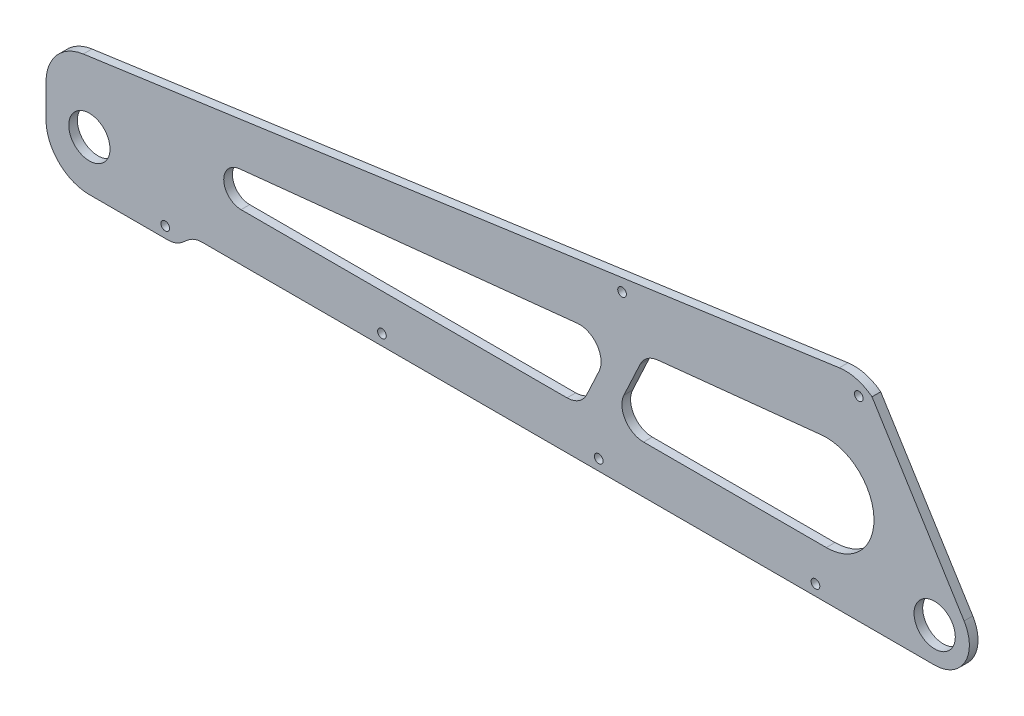
ISO-10303-21;
HEADER;
FILE_DESCRIPTION(('STEP AP214'),'2;1');
FILE_NAME('part.step','',(''),(''),'','','');
FILE_SCHEMA(('AUTOMOTIVE_DESIGN { 1 0 10303 214 1 1 1 1 }'));
ENDSEC;
DATA;
#1=APPLICATION_CONTEXT('core data for automotive mechanical design processes');
#2=APPLICATION_PROTOCOL_DEFINITION('international standard','automotive_design',2000,#1);
#3=PRODUCT_CONTEXT('',#1,'mechanical');
#4=PRODUCT('Part','Part','',(#3));
#5=PRODUCT_RELATED_PRODUCT_CATEGORY('part','',(#4));
#6=PRODUCT_DEFINITION_FORMATION('','',#4);
#7=PRODUCT_DEFINITION_CONTEXT('part definition',#1,'design');
#8=PRODUCT_DEFINITION('design','',#6,#7);
#9=PRODUCT_DEFINITION_SHAPE('','',#8);
#10=(LENGTH_UNIT() NAMED_UNIT(*) SI_UNIT(.MILLI.,.METRE.));
#11=(NAMED_UNIT(*) PLANE_ANGLE_UNIT() SI_UNIT($,.RADIAN.));
#12=(NAMED_UNIT(*) SI_UNIT($,.STERADIAN.) SOLID_ANGLE_UNIT());
#13=UNCERTAINTY_MEASURE_WITH_UNIT(LENGTH_MEASURE(1.E-05),#10,'distance_accuracy_value','');
#14=(GEOMETRIC_REPRESENTATION_CONTEXT(3) GLOBAL_UNCERTAINTY_ASSIGNED_CONTEXT((#13)) GLOBAL_UNIT_ASSIGNED_CONTEXT((#10,
#11,#12)) REPRESENTATION_CONTEXT('',''));
#15=CARTESIAN_POINT('',(0.,0.,0.));
#16=DIRECTION('',(0.,0.,1.));
#17=DIRECTION('',(1.,0.,0.));
#18=AXIS2_PLACEMENT_3D('',#15,#16,#17);
#19=CARTESIAN_POINT('',(175.291428570972,-28.5717369688571,4.));
#20=DIRECTION('',(0.,0.,1.));
#21=DIRECTION('',(1.,0.,0.));
#22=AXIS2_PLACEMENT_3D('',#19,#20,#21);
#23=PLANE('',#22);
#24=CARTESIAN_POINT('',(-179.708571428571,-46.5717369690893,4.));
#25=DIRECTION('',(0.,0.,1.));
#26=DIRECTION('',(1.,0.,0.));
#27=AXIS2_PLACEMENT_3D('',#24,#25,#26);
#28=CIRCLE('',#27,2.);
#29=CARTESIAN_POINT('',(-177.708571428571,-46.5717369690893,4.));
#30=VERTEX_POINT('',#29);
#31=EDGE_CURVE('E341',#30,#30,#28,.T.);
#32=ORIENTED_EDGE('',*,*,#31,.F.);
#33=EDGE_LOOP('',(#32));
#34=FACE_BOUND('',#33,.T.);
#35=CARTESIAN_POINT('',(-214.708571428571,-28.5717369690891,4.));
#36=DIRECTION('',(0.,0.,1.));
#37=DIRECTION('',(1.,0.,0.));
#38=AXIS2_PLACEMENT_3D('',#35,#36,#37);
#39=CIRCLE('',#38,9.52);
#40=CARTESIAN_POINT('',(-205.188571428571,-28.5717369690891,4.));
#41=VERTEX_POINT('',#40);
#42=EDGE_CURVE('E357',#41,#41,#39,.T.);
#43=ORIENTED_EDGE('',*,*,#42,.F.);
#44=EDGE_LOOP('',(#43));
#45=FACE_BOUND('',#44,.T.);
#46=CARTESIAN_POINT('',(175.291428570972,-28.5717369688571,4.));
#47=DIRECTION('',(0.,0.,1.));
#48=DIRECTION('',(1.,0.,0.));
#49=AXIS2_PLACEMENT_3D('',#46,#47,#48);
#50=CIRCLE('',#49,9.52000000010776);
#51=CARTESIAN_POINT('',(184.81142857108,-28.5717369688571,4.));
#52=VERTEX_POINT('',#51);
#53=EDGE_CURVE('E373',#52,#52,#50,.T.);
#54=ORIENTED_EDGE('',*,*,#53,.F.);
#55=EDGE_LOOP('',(#54));
#56=FACE_BOUND('',#55,.T.);
#57=CARTESIAN_POINT('',(120.291428571429,-39.5717369690891,4.));
#58=DIRECTION('',(0.,0.,1.));
#59=DIRECTION('',(1.,0.,0.));
#60=AXIS2_PLACEMENT_3D('',#57,#58,#59);
#61=CIRCLE('',#60,2.);
#62=CARTESIAN_POINT('',(122.291428571429,-39.5717369690891,4.));
#63=VERTEX_POINT('',#62);
#64=EDGE_CURVE('E389',#63,#63,#61,.T.);
#65=ORIENTED_EDGE('',*,*,#64,.F.);
#66=EDGE_LOOP('',(#65));
#67=FACE_BOUND('',#66,.T.);
#68=CARTESIAN_POINT('',(175.291428570972,-28.5717369688571,4.));
#69=DIRECTION('',(0.,0.,1.));
#70=DIRECTION('',(1.,0.,0.));
#71=AXIS2_PLACEMENT_3D('',#68,#69,#70);
#72=CIRCLE('',#71,16.0000000002321);
#73=CARTESIAN_POINT('',(175.291428570972,-44.5717369690892,4.));
#74=VERTEX_POINT('',#73);
#75=CARTESIAN_POINT('',(188.878227523528,-20.1219503307073,4.));
#76=VERTEX_POINT('',#75);
#77=EDGE_CURVE('E397',#74,#76,#72,.T.);
#78=ORIENTED_EDGE('',*,*,#77,.T.);
#79=DIRECTION('',(-0.528111664876703,0.84917493452242,0.));
#80=VECTOR('',#79,1.);
#81=CARTESIAN_POINT('',(146.384140968189,48.2062377555093,4.));
#82=LINE('',#81,#80);
#83=CARTESIAN_POINT('',(146.384140968189,48.2062377555093,4.));
#84=VERTEX_POINT('',#83);
#85=EDGE_CURVE('E401',#76,#84,#82,.T.);
#86=ORIENTED_EDGE('',*,*,#85,.T.);
#87=CARTESIAN_POINT('',(134.070911461676,32.446022683375,4.));
#88=DIRECTION('',(0.,0.,1.));
#89=DIRECTION('',(1.,0.,0.));
#90=AXIS2_PLACEMENT_3D('',#87,#88,#89);
#91=CIRCLE('',#90,19.9999999999998);
#92=CARTESIAN_POINT('',(131.287449442474,52.2513840582062,4.));
#93=VERTEX_POINT('',#92);
#94=EDGE_CURVE('E405',#84,#93,#91,.T.);
#95=ORIENTED_EDGE('',*,*,#94,.T.);
#96=DIRECTION('',(-0.99026806874157,-0.139173100960066,0.));
#97=VECTOR('',#96,1.);
#98=CARTESIAN_POINT('',(-217.492033447773,3.2336244057423,4.));
#99=LINE('',#98,#97);
#100=CARTESIAN_POINT('',(-217.492033447773,3.23362440574231,4.));
#101=VERTEX_POINT('',#100);
#102=EDGE_CURVE('E408',#93,#101,#99,.T.);
#103=ORIENTED_EDGE('',*,*,#102,.T.);
#104=CARTESIAN_POINT('',(-214.708571428571,-16.5717369690893,4.));
#105=DIRECTION('',(0.,0.,1.));
#106=DIRECTION('',(1.,0.,0.));
#107=AXIS2_PLACEMENT_3D('',#104,#105,#106);
#108=CIRCLE('',#107,20.0000000000002);
#109=CARTESIAN_POINT('',(-234.708571428571,-16.5717369690891,4.));
#110=VERTEX_POINT('',#109);
#111=EDGE_CURVE('E411',#101,#110,#108,.T.);
#112=ORIENTED_EDGE('',*,*,#111,.T.);
#113=DIRECTION('',(0.,-1.,0.));
#114=VECTOR('',#113,1.);
#115=CARTESIAN_POINT('',(-234.708571428571,-31.5717369690891,4.));
#116=LINE('',#115,#114);
#117=CARTESIAN_POINT('',(-234.708571428571,-31.5717369690891,4.));
#118=VERTEX_POINT('',#117);
#119=EDGE_CURVE('E414',#110,#118,#116,.T.);
#120=ORIENTED_EDGE('',*,*,#119,.T.);
#121=CARTESIAN_POINT('',(-214.708571428571,-31.5717369690889,4.));
#122=DIRECTION('',(0.,0.,1.));
#123=DIRECTION('',(1.,0.,0.));
#124=AXIS2_PLACEMENT_3D('',#121,#122,#123);
#125=CIRCLE('',#124,20.0000000000002);
#126=CARTESIAN_POINT('',(-214.708571428571,-51.5717369690891,4.));
#127=VERTEX_POINT('',#126);
#128=EDGE_CURVE('E417',#118,#127,#125,.T.);
#129=ORIENTED_EDGE('',*,*,#128,.T.);
#130=DIRECTION('',(1.,0.,0.));
#131=VECTOR('',#130,1.);
#132=CARTESIAN_POINT('',(-178.348273771233,-51.5717369690891,4.));
#133=LINE('',#132,#131);
#134=CARTESIAN_POINT('',(-178.348273771233,-51.5717369690891,4.));
#135=VERTEX_POINT('',#134);
#136=EDGE_CURVE('E420',#127,#135,#133,.T.);
#137=ORIENTED_EDGE('',*,*,#136,.T.);
#138=CARTESIAN_POINT('',(-178.348273771233,-41.5717369690893,4.));
#139=DIRECTION('',(0.,0.,1.));
#140=DIRECTION('',(1.,0.,0.));
#141=AXIS2_PLACEMENT_3D('',#138,#139,#140);
#142=CIRCLE('',#141,9.99999999999978);
#143=CARTESIAN_POINT('',(-171.920397674368,-49.2321814002789,4.));
#144=VERTEX_POINT('',#143);
#145=EDGE_CURVE('E423',#135,#144,#142,.T.);
#146=ORIENTED_EDGE('',*,*,#145,.T.);
#147=DIRECTION('',(0.766044443118976,0.642787609686542,0.));
#148=VECTOR('',#147,1.);
#149=CARTESIAN_POINT('',(-169.154470034615,-46.9112925378994,4.));
#150=LINE('',#149,#148);
#151=CARTESIAN_POINT('',(-169.154470034615,-46.9112925378993,4.));
#152=VERTEX_POINT('',#151);
#153=EDGE_CURVE('E426',#144,#152,#150,.T.);
#154=ORIENTED_EDGE('',*,*,#153,.T.);
#155=CARTESIAN_POINT('',(-162.72659393775,-54.5717369690888,4.));
#156=DIRECTION('',(0.,0.,-1.));
#157=DIRECTION('',(1.,0.,0.));
#158=AXIS2_PLACEMENT_3D('',#155,#156,#157);
#159=CIRCLE('',#158,9.99999999999969);
#160=CARTESIAN_POINT('',(-162.72659393775,-44.5717369690891,4.));
#161=VERTEX_POINT('',#160);
#162=EDGE_CURVE('E429',#152,#161,#159,.T.);
#163=ORIENTED_EDGE('',*,*,#162,.T.);
#164=DIRECTION('',(1.,0.,0.));
#165=VECTOR('',#164,1.);
#166=CARTESIAN_POINT('',(-162.72659393775,-44.5717369690891,4.));
#167=LINE('',#166,#165);
#168=EDGE_CURVE('E432',#161,#74,#167,.T.);
#169=ORIENTED_EDGE('',*,*,#168,.T.);
#170=EDGE_LOOP('',(#78,#86,#95,#103,#112,#120,#129,#137,#146,#154,#163,#169));
#171=FACE_BOUND('',#170,.T.);
#172=CARTESIAN_POINT('',(31.0623115741737,32.4282630309108,4.));
#173=DIRECTION('',(0.,0.,1.));
#174=DIRECTION('',(1.,0.,0.));
#175=AXIS2_PLACEMENT_3D('',#172,#173,#174);
#176=CIRCLE('',#175,2.);
#177=CARTESIAN_POINT('',(33.0623115741737,32.4282630309108,4.));
#178=VERTEX_POINT('',#177);
#179=EDGE_CURVE('E381',#178,#178,#176,.T.);
#180=ORIENTED_EDGE('',*,*,#179,.F.);
#181=EDGE_LOOP('',(#180));
#182=FACE_BOUND('',#181,.T.);
#183=CARTESIAN_POINT('',(-79.7085714285713,-39.5717369690891,4.));
#184=DIRECTION('',(0.,0.,1.));
#185=DIRECTION('',(1.,0.,0.));
#186=AXIS2_PLACEMENT_3D('',#183,#184,#185);
#187=CIRCLE('',#186,2.);
#188=CARTESIAN_POINT('',(-77.7085714285713,-39.5717369690891,4.));
#189=VERTEX_POINT('',#188);
#190=EDGE_CURVE('E365',#189,#189,#187,.T.);
#191=ORIENTED_EDGE('',*,*,#190,.F.);
#192=EDGE_LOOP('',(#191));
#193=FACE_BOUND('',#192,.T.);
#194=CARTESIAN_POINT('',(140.291428571429,45.4282630309109,4.));
#195=DIRECTION('',(0.,0.,1.));
#196=DIRECTION('',(1.,0.,0.));
#197=AXIS2_PLACEMENT_3D('',#194,#195,#196);
#198=CIRCLE('',#197,2.);
#199=CARTESIAN_POINT('',(142.291428571429,45.4282630309109,4.));
#200=VERTEX_POINT('',#199);
#201=EDGE_CURVE('E349',#200,#200,#198,.T.);
#202=ORIENTED_EDGE('',*,*,#201,.F.);
#203=EDGE_LOOP('',(#202));
#204=FACE_BOUND('',#203,.T.);
#205=CARTESIAN_POINT('',(20.2914285714287,-39.5717369690891,4.));
#206=DIRECTION('',(0.,0.,1.));
#207=DIRECTION('',(1.,0.,0.));
#208=AXIS2_PLACEMENT_3D('',#205,#206,#207);
#209=CIRCLE('',#208,2.);
#210=CARTESIAN_POINT('',(22.2914285714287,-39.5717369690891,4.));
#211=VERTEX_POINT('',#210);
#212=EDGE_CURVE('E333',#211,#211,#209,.T.);
#213=ORIENTED_EDGE('',*,*,#212,.F.);
#214=EDGE_LOOP('',(#213));
#215=FACE_BOUND('',#214,.T.);
#216=DIRECTION('',(1.,0.,0.));
#217=VECTOR('',#216,1.);
#218=CARTESIAN_POINT('',(40.9882843426035,-22.5717369690892,4.));
#219=LINE('',#218,#217);
#220=CARTESIAN_POINT('',(40.9882843426035,-22.5717369690892,4.));
#221=VERTEX_POINT('',#220);
#222=CARTESIAN_POINT('',(125.291428571429,-22.5717369690892,4.));
#223=VERTEX_POINT('',#222);
#224=EDGE_CURVE('E273',#221,#223,#219,.T.);
#225=ORIENTED_EDGE('',*,*,#224,.F.);
#226=CARTESIAN_POINT('',(40.9882843426036,-12.5717369690891,4.));
#227=DIRECTION('',(0.,0.,1.));
#228=DIRECTION('',(1.,0.,0.));
#229=AXIS2_PLACEMENT_3D('',#226,#227,#228);
#230=CIRCLE('',#229,10.);
#231=CARTESIAN_POINT('',(31.925206472237,-8.34555435168218,4.));
#232=VERTEX_POINT('',#231);
#233=EDGE_CURVE('E270',#232,#221,#230,.T.);
#234=ORIENTED_EDGE('',*,*,#233,.F.);
#235=DIRECTION('',(-0.422618261740698,-0.906307787036651,0.));
#236=VECTOR('',#235,1.);
#237=CARTESIAN_POINT('',(39.4225877131874,7.73263160523445,4.));
#238=LINE('',#237,#236);
#239=CARTESIAN_POINT('',(39.4225877131873,7.73263160523445,4.));
#240=VERTEX_POINT('',#239);
#241=EDGE_CURVE('E287',#240,#232,#238,.T.);
#242=ORIENTED_EDGE('',*,*,#241,.F.);
#243=CARTESIAN_POINT('',(48.4856655835538,3.50644898782758,4.));
#244=DIRECTION('',(0.,0.,1.));
#245=DIRECTION('',(1.,0.,0.));
#246=AXIS2_PLACEMENT_3D('',#243,#244,#245);
#247=CIRCLE('',#246,9.9999999999999);
#248=CARTESIAN_POINT('',(47.4514092630986,13.4528208823224,4.));
#249=VERTEX_POINT('',#248);
#250=EDGE_CURVE('E283',#249,#240,#247,.T.);
#251=ORIENTED_EDGE('',*,*,#250,.F.);
#252=DIRECTION('',(-0.994637189449491,-0.103425632045529,0.));
#253=VECTOR('',#252,1.);
#254=CARTESIAN_POINT('',(123.016064666427,21.3102811987996,4.));
#255=LINE('',#254,#253);
#256=CARTESIAN_POINT('',(123.016064666427,21.3102811987996,4.));
#257=VERTEX_POINT('',#256);
#258=EDGE_CURVE('E280',#257,#249,#255,.T.);
#259=ORIENTED_EDGE('',*,*,#258,.F.);
#260=CARTESIAN_POINT('',(125.291428571429,-0.571736969089159,4.));
#261=DIRECTION('',(0.,0.,1.));
#262=DIRECTION('',(1.,0.,0.));
#263=AXIS2_PLACEMENT_3D('',#260,#261,#262);
#264=CIRCLE('',#263,22.);
#265=EDGE_CURVE('E277',#223,#257,#264,.T.);
#266=ORIENTED_EDGE('',*,*,#265,.F.);
#267=EDGE_LOOP('',(#225,#234,#242,#251,#259,#266));
#268=FACE_BOUND('',#267,.T.);
#269=DIRECTION('',(1.,0.,0.));
#270=VECTOR('',#269,1.);
#271=CARTESIAN_POINT('',(-144.708571428571,-22.5717369690892,4.));
#272=LINE('',#271,#270);
#273=CARTESIAN_POINT('',(-144.708571428571,-22.5717369690892,4.));
#274=VERTEX_POINT('',#273);
#275=CARTESIAN_POINT('',(5.68019093580383,-22.5717369690892,4.));
#276=VERTEX_POINT('',#275);
#277=EDGE_CURVE('E210',#274,#276,#272,.T.);
#278=ORIENTED_EDGE('',*,*,#277,.F.);
#279=CARTESIAN_POINT('',(-144.708571428571,-14.5717369690891,4.));
#280=DIRECTION('',(0.,0.,1.));
#281=DIRECTION('',(1.,0.,0.));
#282=AXIS2_PLACEMENT_3D('',#279,#280,#281);
#283=CIRCLE('',#282,8.00000000000001);
#284=CARTESIAN_POINT('',(-145.535976484936,-6.61463945349322,4.));
#285=VERTEX_POINT('',#284);
#286=EDGE_CURVE('E201',#285,#274,#283,.T.);
#287=ORIENTED_EDGE('',*,*,#286,.F.);
#288=DIRECTION('',(-0.994637189449491,-0.103425632045529,0.));
#289=VECTOR('',#288,1.);
#290=CARTESIAN_POINT('',(10.3440467415016,9.59427581378043,4.));
#291=LINE('',#290,#289);
#292=CARTESIAN_POINT('',(10.3440467415016,9.59427581378042,4.));
#293=VERTEX_POINT('',#292);
#294=EDGE_CURVE('E236',#293,#285,#291,.T.);
#295=ORIENTED_EDGE('',*,*,#294,.F.);
#296=CARTESIAN_POINT('',(11.3783030619568,-0.352096080714473,4.));
#297=DIRECTION('',(0.,0.,1.));
#298=DIRECTION('',(1.,0.,0.));
#299=AXIS2_PLACEMENT_3D('',#296,#297,#298);
#300=CIRCLE('',#299,9.99999999999997);
#301=CARTESIAN_POINT('',(20.4413809323233,-4.57827869812142,4.));
#302=VERTEX_POINT('',#301);
#303=EDGE_CURVE('E233',#302,#293,#300,.T.);
#304=ORIENTED_EDGE('',*,*,#303,.F.);
#305=DIRECTION('',(0.422618261740691,0.906307787036654,0.));
#306=VECTOR('',#305,1.);
#307=CARTESIAN_POINT('',(14.7432688061705,-16.7979195864959,4.));
#308=LINE('',#307,#306);
#309=CARTESIAN_POINT('',(14.7432688061705,-16.7979195864959,4.));
#310=VERTEX_POINT('',#309);
#311=EDGE_CURVE('E228',#310,#302,#308,.T.);
#312=ORIENTED_EDGE('',*,*,#311,.F.);
#313=CARTESIAN_POINT('',(5.68019093580388,-12.5717369690892,4.));
#314=DIRECTION('',(0.,0.,1.));
#315=DIRECTION('',(1.,0.,0.));
#316=AXIS2_PLACEMENT_3D('',#313,#314,#315);
#317=CIRCLE('',#316,9.99999999999993);
#318=EDGE_CURVE('E224',#276,#310,#317,.T.);
#319=ORIENTED_EDGE('',*,*,#318,.F.);
#320=EDGE_LOOP('',(#278,#287,#295,#304,#312,#319));
#321=FACE_BOUND('',#320,.T.);
#322=ADVANCED_FACE('F39',(#34,#45,#56,#67,#171,#182,#193,#204,#215,#268,#321),#23,.T.);
#323=CARTESIAN_POINT('',(175.291428570972,-28.5717369688571,0.));
#324=DIRECTION('',(0.,0.,1.));
#325=DIRECTION('',(1.,0.,0.));
#326=AXIS2_PLACEMENT_3D('',#323,#324,#325);
#327=PLANE('',#326);
#328=CARTESIAN_POINT('',(40.9882843426036,-12.5717369690891,0.));
#329=DIRECTION('',(0.,0.,1.));
#330=DIRECTION('',(1.,0.,0.));
#331=AXIS2_PLACEMENT_3D('',#328,#329,#330);
#332=CIRCLE('',#331,10.);
#333=CARTESIAN_POINT('',(31.925206472237,-8.34555435168217,0.));
#334=VERTEX_POINT('',#333);
#335=CARTESIAN_POINT('',(40.9882843426035,-22.5717369690892,0.));
#336=VERTEX_POINT('',#335);
#337=EDGE_CURVE('E219',#334,#336,#332,.T.);
#338=ORIENTED_EDGE('',*,*,#337,.T.);
#339=DIRECTION('',(1.,0.,0.));
#340=VECTOR('',#339,1.);
#341=CARTESIAN_POINT('',(40.9882843426035,-22.5717369690892,0.));
#342=LINE('',#341,#340);
#343=CARTESIAN_POINT('',(125.291428571429,-22.5717369690892,0.));
#344=VERTEX_POINT('',#343);
#345=EDGE_CURVE('E294',#336,#344,#342,.T.);
#346=ORIENTED_EDGE('',*,*,#345,.T.);
#347=CARTESIAN_POINT('',(125.291428571429,-0.571736969089159,0.));
#348=DIRECTION('',(0.,0.,1.));
#349=DIRECTION('',(1.,0.,0.));
#350=AXIS2_PLACEMENT_3D('',#347,#348,#349);
#351=CIRCLE('',#350,22.);
#352=CARTESIAN_POINT('',(123.016064666427,21.3102811987996,0.));
#353=VERTEX_POINT('',#352);
#354=EDGE_CURVE('E298',#344,#353,#351,.T.);
#355=ORIENTED_EDGE('',*,*,#354,.T.);
#356=DIRECTION('',(-0.994637189449491,-0.103425632045529,0.));
#357=VECTOR('',#356,1.);
#358=CARTESIAN_POINT('',(123.016064666427,21.3102811987996,0.));
#359=LINE('',#358,#357);
#360=CARTESIAN_POINT('',(47.4514092630986,13.4528208823224,0.));
#361=VERTEX_POINT('',#360);
#362=EDGE_CURVE('E302',#353,#361,#359,.T.);
#363=ORIENTED_EDGE('',*,*,#362,.T.);
#364=CARTESIAN_POINT('',(48.4856655835538,3.50644898782758,0.));
#365=DIRECTION('',(0.,0.,1.));
#366=DIRECTION('',(1.,0.,0.));
#367=AXIS2_PLACEMENT_3D('',#364,#365,#366);
#368=CIRCLE('',#367,9.9999999999999);
#369=CARTESIAN_POINT('',(39.4225877131874,7.73263160523445,0.));
#370=VERTEX_POINT('',#369);
#371=EDGE_CURVE('E306',#361,#370,#368,.T.);
#372=ORIENTED_EDGE('',*,*,#371,.T.);
#373=DIRECTION('',(-0.422618261740698,-0.906307787036651,0.));
#374=VECTOR('',#373,1.);
#375=CARTESIAN_POINT('',(39.4225877131874,7.73263160523445,0.));
#376=LINE('',#375,#374);
#377=EDGE_CURVE('E274',#370,#334,#376,.T.);
#378=ORIENTED_EDGE('',*,*,#377,.T.);
#379=EDGE_LOOP('',(#338,#346,#355,#363,#372,#378));
#380=FACE_BOUND('',#379,.T.);
#381=CARTESIAN_POINT('',(175.291428570972,-28.5717369688571,0.));
#382=DIRECTION('',(0.,0.,1.));
#383=DIRECTION('',(1.,0.,0.));
#384=AXIS2_PLACEMENT_3D('',#381,#382,#383);
#385=CIRCLE('',#384,16.0000000002321);
#386=CARTESIAN_POINT('',(175.291428570972,-44.5717369690892,0.));
#387=VERTEX_POINT('',#386);
#388=CARTESIAN_POINT('',(188.878227523528,-20.1219503307073,0.));
#389=VERTEX_POINT('',#388);
#390=EDGE_CURVE('E393',#387,#389,#385,.T.);
#391=ORIENTED_EDGE('',*,*,#390,.F.);
#392=DIRECTION('',(1.,0.,0.));
#393=VECTOR('',#392,1.);
#394=CARTESIAN_POINT('',(-162.72659393775,-44.5717369690891,0.));
#395=LINE('',#394,#393);
#396=CARTESIAN_POINT('',(-162.72659393775,-44.5717369690891,0.));
#397=VERTEX_POINT('',#396);
#398=EDGE_CURVE('E402',#397,#387,#395,.T.);
#399=ORIENTED_EDGE('',*,*,#398,.F.);
#400=CARTESIAN_POINT('',(-162.72659393775,-54.5717369690888,0.));
#401=DIRECTION('',(0.,0.,-1.));
#402=DIRECTION('',(1.,0.,0.));
#403=AXIS2_PLACEMENT_3D('',#400,#401,#402);
#404=CIRCLE('',#403,9.99999999999969);
#405=CARTESIAN_POINT('',(-169.154470034615,-46.9112925378993,0.));
#406=VERTEX_POINT('',#405);
#407=EDGE_CURVE('E466',#406,#397,#404,.T.);
#408=ORIENTED_EDGE('',*,*,#407,.F.);
#409=DIRECTION('',(0.766044443118976,0.642787609686542,0.));
#410=VECTOR('',#409,1.);
#411=CARTESIAN_POINT('',(-169.154470034615,-46.9112925378994,0.));
#412=LINE('',#411,#410);
#413=CARTESIAN_POINT('',(-171.920397674368,-49.2321814002789,0.));
#414=VERTEX_POINT('',#413);
#415=EDGE_CURVE('E463',#414,#406,#412,.T.);
#416=ORIENTED_EDGE('',*,*,#415,.F.);
#417=CARTESIAN_POINT('',(-178.348273771233,-41.5717369690893,0.));
#418=DIRECTION('',(0.,0.,1.));
#419=DIRECTION('',(1.,0.,0.));
#420=AXIS2_PLACEMENT_3D('',#417,#418,#419);
#421=CIRCLE('',#420,9.99999999999978);
#422=CARTESIAN_POINT('',(-178.348273771233,-51.5717369690891,0.));
#423=VERTEX_POINT('',#422);
#424=EDGE_CURVE('E460',#423,#414,#421,.T.);
#425=ORIENTED_EDGE('',*,*,#424,.F.);
#426=DIRECTION('',(1.,0.,0.));
#427=VECTOR('',#426,1.);
#428=CARTESIAN_POINT('',(-178.348273771233,-51.5717369690891,0.));
#429=LINE('',#428,#427);
#430=CARTESIAN_POINT('',(-214.708571428571,-51.5717369690891,0.));
#431=VERTEX_POINT('',#430);
#432=EDGE_CURVE('E457',#431,#423,#429,.T.);
#433=ORIENTED_EDGE('',*,*,#432,.F.);
#434=CARTESIAN_POINT('',(-214.708571428571,-31.5717369690889,0.));
#435=DIRECTION('',(0.,0.,1.));
#436=DIRECTION('',(1.,0.,0.));
#437=AXIS2_PLACEMENT_3D('',#434,#435,#436);
#438=CIRCLE('',#437,20.0000000000002);
#439=CARTESIAN_POINT('',(-234.708571428571,-31.5717369690891,0.));
#440=VERTEX_POINT('',#439);
#441=EDGE_CURVE('E454',#440,#431,#438,.T.);
#442=ORIENTED_EDGE('',*,*,#441,.F.);
#443=DIRECTION('',(0.,-1.,0.));
#444=VECTOR('',#443,1.);
#445=CARTESIAN_POINT('',(-234.708571428571,-31.5717369690891,0.));
#446=LINE('',#445,#444);
#447=CARTESIAN_POINT('',(-234.708571428571,-16.5717369690891,0.));
#448=VERTEX_POINT('',#447);
#449=EDGE_CURVE('E451',#448,#440,#446,.T.);
#450=ORIENTED_EDGE('',*,*,#449,.F.);
#451=CARTESIAN_POINT('',(-214.708571428571,-16.5717369690893,0.));
#452=DIRECTION('',(0.,0.,1.));
#453=DIRECTION('',(1.,0.,0.));
#454=AXIS2_PLACEMENT_3D('',#451,#452,#453);
#455=CIRCLE('',#454,20.0000000000002);
#456=CARTESIAN_POINT('',(-217.492033447773,3.23362440574231,0.));
#457=VERTEX_POINT('',#456);
#458=EDGE_CURVE('E448',#457,#448,#455,.T.);
#459=ORIENTED_EDGE('',*,*,#458,.F.);
#460=DIRECTION('',(-0.99026806874157,-0.139173100960066,0.));
#461=VECTOR('',#460,1.);
#462=CARTESIAN_POINT('',(-217.492033447773,3.2336244057423,0.));
#463=LINE('',#462,#461);
#464=CARTESIAN_POINT('',(131.287449442474,52.2513840582062,0.));
#465=VERTEX_POINT('',#464);
#466=EDGE_CURVE('E445',#465,#457,#463,.T.);
#467=ORIENTED_EDGE('',*,*,#466,.F.);
#468=CARTESIAN_POINT('',(134.070911461676,32.446022683375,0.));
#469=DIRECTION('',(0.,0.,1.));
#470=DIRECTION('',(1.,0.,0.));
#471=AXIS2_PLACEMENT_3D('',#468,#469,#470);
#472=CIRCLE('',#471,19.9999999999998);
#473=CARTESIAN_POINT('',(146.384140968189,48.2062377555093,0.));
#474=VERTEX_POINT('',#473);
#475=EDGE_CURVE('E442',#474,#465,#472,.T.);
#476=ORIENTED_EDGE('',*,*,#475,.F.);
#477=DIRECTION('',(-0.528111664876703,0.84917493452242,0.));
#478=VECTOR('',#477,1.);
#479=CARTESIAN_POINT('',(146.384140968189,48.2062377555093,0.));
#480=LINE('',#479,#478);
#481=EDGE_CURVE('E439',#389,#474,#480,.T.);
#482=ORIENTED_EDGE('',*,*,#481,.F.);
#483=EDGE_LOOP('',(#391,#399,#408,#416,#425,#433,#442,#450,#459,#467,#476,#482));
#484=FACE_BOUND('',#483,.T.);
#485=CARTESIAN_POINT('',(120.291428571429,-39.5717369690891,0.));
#486=DIRECTION('',(0.,0.,1.));
#487=DIRECTION('',(1.,0.,0.));
#488=AXIS2_PLACEMENT_3D('',#485,#486,#487);
#489=CIRCLE('',#488,2.);
#490=CARTESIAN_POINT('',(122.291428571429,-39.5717369690891,0.));
#491=VERTEX_POINT('',#490);
#492=EDGE_CURVE('E385',#491,#491,#489,.T.);
#493=ORIENTED_EDGE('',*,*,#492,.T.);
#494=EDGE_LOOP('',(#493));
#495=FACE_BOUND('',#494,.T.);
#496=CARTESIAN_POINT('',(31.0623115741737,32.4282630309108,0.));
#497=DIRECTION('',(0.,0.,1.));
#498=DIRECTION('',(1.,0.,0.));
#499=AXIS2_PLACEMENT_3D('',#496,#497,#498);
#500=CIRCLE('',#499,2.);
#501=CARTESIAN_POINT('',(33.0623115741737,32.4282630309108,0.));
#502=VERTEX_POINT('',#501);
#503=EDGE_CURVE('E377',#502,#502,#500,.T.);
#504=ORIENTED_EDGE('',*,*,#503,.T.);
#505=EDGE_LOOP('',(#504));
#506=FACE_BOUND('',#505,.T.);
#507=CARTESIAN_POINT('',(175.291428570972,-28.5717369688571,0.));
#508=DIRECTION('',(0.,0.,1.));
#509=DIRECTION('',(1.,0.,0.));
#510=AXIS2_PLACEMENT_3D('',#507,#508,#509);
#511=CIRCLE('',#510,9.52000000010776);
#512=CARTESIAN_POINT('',(184.81142857108,-28.5717369688571,0.));
#513=VERTEX_POINT('',#512);
#514=EDGE_CURVE('E369',#513,#513,#511,.T.);
#515=ORIENTED_EDGE('',*,*,#514,.T.);
#516=EDGE_LOOP('',(#515));
#517=FACE_BOUND('',#516,.T.);
#518=CARTESIAN_POINT('',(-79.7085714285713,-39.5717369690891,0.));
#519=DIRECTION('',(0.,0.,1.));
#520=DIRECTION('',(1.,0.,0.));
#521=AXIS2_PLACEMENT_3D('',#518,#519,#520);
#522=CIRCLE('',#521,2.);
#523=CARTESIAN_POINT('',(-77.7085714285713,-39.5717369690891,0.));
#524=VERTEX_POINT('',#523);
#525=EDGE_CURVE('E361',#524,#524,#522,.T.);
#526=ORIENTED_EDGE('',*,*,#525,.T.);
#527=EDGE_LOOP('',(#526));
#528=FACE_BOUND('',#527,.T.);
#529=CARTESIAN_POINT('',(-214.708571428571,-28.5717369690891,0.));
#530=DIRECTION('',(0.,0.,1.));
#531=DIRECTION('',(1.,0.,0.));
#532=AXIS2_PLACEMENT_3D('',#529,#530,#531);
#533=CIRCLE('',#532,9.52);
#534=CARTESIAN_POINT('',(-205.188571428571,-28.5717369690891,0.));
#535=VERTEX_POINT('',#534);
#536=EDGE_CURVE('E353',#535,#535,#533,.T.);
#537=ORIENTED_EDGE('',*,*,#536,.T.);
#538=EDGE_LOOP('',(#537));
#539=FACE_BOUND('',#538,.T.);
#540=CARTESIAN_POINT('',(140.291428571429,45.4282630309109,0.));
#541=DIRECTION('',(0.,0.,1.));
#542=DIRECTION('',(1.,0.,0.));
#543=AXIS2_PLACEMENT_3D('',#540,#541,#542);
#544=CIRCLE('',#543,2.);
#545=CARTESIAN_POINT('',(142.291428571429,45.4282630309109,0.));
#546=VERTEX_POINT('',#545);
#547=EDGE_CURVE('E345',#546,#546,#544,.T.);
#548=ORIENTED_EDGE('',*,*,#547,.T.);
#549=EDGE_LOOP('',(#548));
#550=FACE_BOUND('',#549,.T.);
#551=CARTESIAN_POINT('',(-179.708571428571,-46.5717369690893,0.));
#552=DIRECTION('',(0.,0.,1.));
#553=DIRECTION('',(1.,0.,0.));
#554=AXIS2_PLACEMENT_3D('',#551,#552,#553);
#555=CIRCLE('',#554,2.);
#556=CARTESIAN_POINT('',(-177.708571428571,-46.5717369690893,0.));
#557=VERTEX_POINT('',#556);
#558=EDGE_CURVE('E337',#557,#557,#555,.T.);
#559=ORIENTED_EDGE('',*,*,#558,.T.);
#560=EDGE_LOOP('',(#559));
#561=FACE_BOUND('',#560,.T.);
#562=CARTESIAN_POINT('',(20.2914285714287,-39.5717369690891,0.));
#563=DIRECTION('',(0.,0.,1.));
#564=DIRECTION('',(1.,0.,0.));
#565=AXIS2_PLACEMENT_3D('',#562,#563,#564);
#566=CIRCLE('',#565,2.);
#567=CARTESIAN_POINT('',(22.2914285714287,-39.5717369690891,0.));
#568=VERTEX_POINT('',#567);
#569=EDGE_CURVE('E332',#568,#568,#566,.T.);
#570=ORIENTED_EDGE('',*,*,#569,.T.);
#571=EDGE_LOOP('',(#570));
#572=FACE_BOUND('',#571,.T.);
#573=CARTESIAN_POINT('',(-144.708571428571,-14.5717369690891,0.));
#574=DIRECTION('',(0.,0.,1.));
#575=DIRECTION('',(1.,0.,0.));
#576=AXIS2_PLACEMENT_3D('',#573,#574,#575);
#577=CIRCLE('',#576,8.00000000000001);
#578=CARTESIAN_POINT('',(-145.535976484936,-6.61463945349323,0.));
#579=VERTEX_POINT('',#578);
#580=CARTESIAN_POINT('',(-144.708571428571,-22.5717369690892,0.));
#581=VERTEX_POINT('',#580);
#582=EDGE_CURVE('E63',#579,#581,#577,.T.);
#583=ORIENTED_EDGE('',*,*,#582,.T.);
#584=DIRECTION('',(1.,0.,0.));
#585=VECTOR('',#584,1.);
#586=CARTESIAN_POINT('',(-144.708571428571,-22.5717369690892,0.));
#587=LINE('',#586,#585);
#588=CARTESIAN_POINT('',(5.68019093580383,-22.5717369690892,0.));
#589=VERTEX_POINT('',#588);
#590=EDGE_CURVE('E217',#581,#589,#587,.T.);
#591=ORIENTED_EDGE('',*,*,#590,.T.);
#592=CARTESIAN_POINT('',(5.68019093580388,-12.5717369690892,0.));
#593=DIRECTION('',(0.,0.,1.));
#594=DIRECTION('',(1.,0.,0.));
#595=AXIS2_PLACEMENT_3D('',#592,#593,#594);
#596=CIRCLE('',#595,9.99999999999993);
#597=CARTESIAN_POINT('',(14.7432688061705,-16.7979195864959,0.));
#598=VERTEX_POINT('',#597);
#599=EDGE_CURVE('E243',#589,#598,#596,.T.);
#600=ORIENTED_EDGE('',*,*,#599,.T.);
#601=DIRECTION('',(0.422618261740691,0.906307787036654,0.));
#602=VECTOR('',#601,1.);
#603=CARTESIAN_POINT('',(14.7432688061705,-16.7979195864959,0.));
#604=LINE('',#603,#602);
#605=CARTESIAN_POINT('',(20.4413809323233,-4.57827869812142,0.));
#606=VERTEX_POINT('',#605);
#607=EDGE_CURVE('E247',#598,#606,#604,.T.);
#608=ORIENTED_EDGE('',*,*,#607,.T.);
#609=CARTESIAN_POINT('',(11.3783030619568,-0.352096080714473,0.));
#610=DIRECTION('',(0.,0.,1.));
#611=DIRECTION('',(1.,0.,0.));
#612=AXIS2_PLACEMENT_3D('',#609,#610,#611);
#613=CIRCLE('',#612,9.99999999999997);
#614=CARTESIAN_POINT('',(10.3440467415016,9.59427581378041,0.));
#615=VERTEX_POINT('',#614);
#616=EDGE_CURVE('E251',#606,#615,#613,.T.);
#617=ORIENTED_EDGE('',*,*,#616,.T.);
#618=DIRECTION('',(-0.994637189449491,-0.103425632045529,0.));
#619=VECTOR('',#618,1.);
#620=CARTESIAN_POINT('',(10.3440467415016,9.59427581378043,0.));
#621=LINE('',#620,#619);
#622=EDGE_CURVE('E211',#615,#579,#621,.T.);
#623=ORIENTED_EDGE('',*,*,#622,.T.);
#624=EDGE_LOOP('',(#583,#591,#600,#608,#617,#623));
#625=FACE_BOUND('',#624,.T.);
#626=ADVANCED_FACE('F521',(#380,#484,#495,#506,#517,#528,#539,#550,#561,#572,#625),#327,.F.);
#627=CARTESIAN_POINT('',(175.291428570972,-28.5717369688571,4.));
#628=DIRECTION('',(0.,0.,-1.));
#629=DIRECTION('',(-1.,0.,0.));
#630=AXIS2_PLACEMENT_3D('',#627,#628,#629);
#631=CYLINDRICAL_SURFACE('',#630,16.0000000002321);
#632=ORIENTED_EDGE('',*,*,#390,.T.);
#633=DIRECTION('',(0.,0.,-1.));
#634=VECTOR('',#633,1.);
#635=CARTESIAN_POINT('',(188.878227523528,-20.1219503307073,4.));
#636=LINE('',#635,#634);
#637=EDGE_CURVE('E11',#76,#389,#636,.T.);
#638=ORIENTED_EDGE('',*,*,#637,.F.);
#639=ORIENTED_EDGE('',*,*,#77,.F.);
#640=DIRECTION('',(0.,0.,-1.));
#641=VECTOR('',#640,1.);
#642=CARTESIAN_POINT('',(175.291428570972,-44.5717369690892,4.));
#643=LINE('',#642,#641);
#644=EDGE_CURVE('E435',#74,#387,#643,.T.);
#645=ORIENTED_EDGE('',*,*,#644,.T.);
#646=EDGE_LOOP('',(#632,#638,#639,#645));
#647=FACE_BOUND('',#646,.T.);
#648=ADVANCED_FACE('F41',(#647),#631,.T.);
#649=CARTESIAN_POINT('',(146.384140968189,48.2062377555093,4.));
#650=DIRECTION('',(-0.84917493452242,-0.528111664876703,0.));
#651=DIRECTION('',(0.528111664876703,-0.84917493452242,0.));
#652=AXIS2_PLACEMENT_3D('',#649,#650,#651);
#653=PLANE('',#652);
#654=ORIENTED_EDGE('',*,*,#481,.T.);
#655=DIRECTION('',(0.,0.,-1.));
#656=VECTOR('',#655,1.);
#657=CARTESIAN_POINT('',(146.384140968189,48.2062377555093,4.));
#658=LINE('',#657,#656);
#659=EDGE_CURVE('E48',#84,#474,#658,.T.);
#660=ORIENTED_EDGE('',*,*,#659,.F.);
#661=ORIENTED_EDGE('',*,*,#85,.F.);
#662=ORIENTED_EDGE('',*,*,#637,.T.);
#663=EDGE_LOOP('',(#654,#660,#661,#662));
#664=FACE_BOUND('',#663,.T.);
#665=ADVANCED_FACE('F539',(#664),#653,.F.);
#666=CARTESIAN_POINT('',(134.070911461676,32.446022683375,4.));
#667=DIRECTION('',(0.,0.,-1.));
#668=DIRECTION('',(-1.,0.,0.));
#669=AXIS2_PLACEMENT_3D('',#666,#667,#668);
#670=CYLINDRICAL_SURFACE('',#669,19.9999999999998);
#671=ORIENTED_EDGE('',*,*,#475,.T.);
#672=DIRECTION('',(0.,0.,-1.));
#673=VECTOR('',#672,1.);
#674=CARTESIAN_POINT('',(131.287449442474,52.2513840582062,4.));
#675=LINE('',#674,#673);
#676=EDGE_CURVE('E506',#93,#465,#675,.T.);
#677=ORIENTED_EDGE('',*,*,#676,.F.);
#678=ORIENTED_EDGE('',*,*,#94,.F.);
#679=ORIENTED_EDGE('',*,*,#659,.T.);
#680=EDGE_LOOP('',(#671,#677,#678,#679));
#681=FACE_BOUND('',#680,.T.);
#682=ADVANCED_FACE('F515',(#681),#670,.T.);
#683=CARTESIAN_POINT('',(-217.492033447773,3.2336244057423,4.));
#684=DIRECTION('',(0.139173100960066,-0.99026806874157,0.));
#685=DIRECTION('',(0.99026806874157,0.139173100960066,0.));
#686=AXIS2_PLACEMENT_3D('',#683,#684,#685);
#687=PLANE('',#686);
#688=ORIENTED_EDGE('',*,*,#466,.T.);
#689=DIRECTION('',(0.,0.,-1.));
#690=VECTOR('',#689,1.);
#691=CARTESIAN_POINT('',(-217.492033447773,3.23362440574231,4.));
#692=LINE('',#691,#690);
#693=EDGE_CURVE('E502',#101,#457,#692,.T.);
#694=ORIENTED_EDGE('',*,*,#693,.F.);
#695=ORIENTED_EDGE('',*,*,#102,.F.);
#696=ORIENTED_EDGE('',*,*,#676,.T.);
#697=EDGE_LOOP('',(#688,#694,#695,#696));
#698=FACE_BOUND('',#697,.T.);
#699=ADVANCED_FACE('F527',(#698),#687,.F.);
#700=CARTESIAN_POINT('',(-214.708571428571,-16.5717369690893,4.));
#701=DIRECTION('',(0.,0.,-1.));
#702=DIRECTION('',(-1.,0.,0.));
#703=AXIS2_PLACEMENT_3D('',#700,#701,#702);
#704=CYLINDRICAL_SURFACE('',#703,20.0000000000002);
#705=ORIENTED_EDGE('',*,*,#458,.T.);
#706=DIRECTION('',(0.,0.,-1.));
#707=VECTOR('',#706,1.);
#708=CARTESIAN_POINT('',(-234.708571428571,-16.5717369690891,4.));
#709=LINE('',#708,#707);
#710=EDGE_CURVE('E498',#110,#448,#709,.T.);
#711=ORIENTED_EDGE('',*,*,#710,.F.);
#712=ORIENTED_EDGE('',*,*,#111,.F.);
#713=ORIENTED_EDGE('',*,*,#693,.T.);
#714=EDGE_LOOP('',(#705,#711,#712,#713));
#715=FACE_BOUND('',#714,.T.);
#716=ADVANCED_FACE('F531',(#715),#704,.T.);
#717=CARTESIAN_POINT('',(-234.708571428571,-31.5717369690891,4.));
#718=DIRECTION('',(1.,0.,0.));
#719=DIRECTION('',(0.,0.,-1.));
#720=AXIS2_PLACEMENT_3D('',#717,#718,#719);
#721=PLANE('',#720);
#722=ORIENTED_EDGE('',*,*,#449,.T.);
#723=DIRECTION('',(0.,0.,-1.));
#724=VECTOR('',#723,1.);
#725=CARTESIAN_POINT('',(-234.708571428571,-31.5717369690891,4.));
#726=LINE('',#725,#724);
#727=EDGE_CURVE('E494',#118,#440,#726,.T.);
#728=ORIENTED_EDGE('',*,*,#727,.F.);
#729=ORIENTED_EDGE('',*,*,#119,.F.);
#730=ORIENTED_EDGE('',*,*,#710,.T.);
#731=EDGE_LOOP('',(#722,#728,#729,#730));
#732=FACE_BOUND('',#731,.T.);
#733=ADVANCED_FACE('F572',(#732),#721,.F.);
#734=CARTESIAN_POINT('',(-214.708571428571,-31.5717369690889,4.));
#735=DIRECTION('',(0.,0.,-1.));
#736=DIRECTION('',(-1.,0.,0.));
#737=AXIS2_PLACEMENT_3D('',#734,#735,#736);
#738=CYLINDRICAL_SURFACE('',#737,20.0000000000002);
#739=ORIENTED_EDGE('',*,*,#441,.T.);
#740=DIRECTION('',(0.,0.,-1.));
#741=VECTOR('',#740,1.);
#742=CARTESIAN_POINT('',(-214.708571428571,-51.5717369690891,4.));
#743=LINE('',#742,#741);
#744=EDGE_CURVE('E490',#127,#431,#743,.T.);
#745=ORIENTED_EDGE('',*,*,#744,.F.);
#746=ORIENTED_EDGE('',*,*,#128,.F.);
#747=ORIENTED_EDGE('',*,*,#727,.T.);
#748=EDGE_LOOP('',(#739,#745,#746,#747));
#749=FACE_BOUND('',#748,.T.);
#750=ADVANCED_FACE('F570',(#749),#738,.T.);
#751=CARTESIAN_POINT('',(-178.348273771233,-51.5717369690891,4.));
#752=DIRECTION('',(0.,1.,0.));
#753=DIRECTION('',(-1.,0.,0.));
#754=AXIS2_PLACEMENT_3D('',#751,#752,#753);
#755=PLANE('',#754);
#756=ORIENTED_EDGE('',*,*,#432,.T.);
#757=DIRECTION('',(0.,0.,-1.));
#758=VECTOR('',#757,1.);
#759=CARTESIAN_POINT('',(-178.348273771233,-51.5717369690891,4.));
#760=LINE('',#759,#758);
#761=EDGE_CURVE('E486',#135,#423,#760,.T.);
#762=ORIENTED_EDGE('',*,*,#761,.F.);
#763=ORIENTED_EDGE('',*,*,#136,.F.);
#764=ORIENTED_EDGE('',*,*,#744,.T.);
#765=EDGE_LOOP('',(#756,#762,#763,#764));
#766=FACE_BOUND('',#765,.T.);
#767=ADVANCED_FACE('F566',(#766),#755,.F.);
#768=CARTESIAN_POINT('',(-178.348273771233,-41.5717369690893,4.));
#769=DIRECTION('',(0.,0.,-1.));
#770=DIRECTION('',(-1.,0.,0.));
#771=AXIS2_PLACEMENT_3D('',#768,#769,#770);
#772=CYLINDRICAL_SURFACE('',#771,9.99999999999978);
#773=ORIENTED_EDGE('',*,*,#424,.T.);
#774=DIRECTION('',(0.,0.,-1.));
#775=VECTOR('',#774,1.);
#776=CARTESIAN_POINT('',(-171.920397674368,-49.2321814002789,4.));
#777=LINE('',#776,#775);
#778=EDGE_CURVE('E482',#144,#414,#777,.T.);
#779=ORIENTED_EDGE('',*,*,#778,.F.);
#780=ORIENTED_EDGE('',*,*,#145,.F.);
#781=ORIENTED_EDGE('',*,*,#761,.T.);
#782=EDGE_LOOP('',(#773,#779,#780,#781));
#783=FACE_BOUND('',#782,.T.);
#784=ADVANCED_FACE('F561',(#783),#772,.T.);
#785=CARTESIAN_POINT('',(-169.154470034615,-46.9112925378994,4.));
#786=DIRECTION('',(-0.642787609686542,0.766044443118976,0.));
#787=DIRECTION('',(-0.766044443118975,-0.642787609686542,0.));
#788=AXIS2_PLACEMENT_3D('',#785,#786,#787);
#789=PLANE('',#788);
#790=ORIENTED_EDGE('',*,*,#415,.T.);
#791=DIRECTION('',(0.,0.,-1.));
#792=VECTOR('',#791,1.);
#793=CARTESIAN_POINT('',(-169.154470034615,-46.9112925378993,4.));
#794=LINE('',#793,#792);
#795=EDGE_CURVE('E478',#152,#406,#794,.T.);
#796=ORIENTED_EDGE('',*,*,#795,.F.);
#797=ORIENTED_EDGE('',*,*,#153,.F.);
#798=ORIENTED_EDGE('',*,*,#778,.T.);
#799=EDGE_LOOP('',(#790,#796,#797,#798));
#800=FACE_BOUND('',#799,.T.);
#801=ADVANCED_FACE('F555',(#800),#789,.F.);
#802=CARTESIAN_POINT('',(-162.72659393775,-54.5717369690888,4.));
#803=DIRECTION('',(0.,0.,-1.));
#804=DIRECTION('',(-1.,0.,0.));
#805=AXIS2_PLACEMENT_3D('',#802,#803,#804);
#806=CYLINDRICAL_SURFACE('',#805,9.99999999999969);
#807=ORIENTED_EDGE('',*,*,#407,.T.);
#808=DIRECTION('',(0.,0.,-1.));
#809=VECTOR('',#808,1.);
#810=CARTESIAN_POINT('',(-162.72659393775,-44.5717369690891,4.));
#811=LINE('',#810,#809);
#812=EDGE_CURVE('E474',#161,#397,#811,.T.);
#813=ORIENTED_EDGE('',*,*,#812,.F.);
#814=ORIENTED_EDGE('',*,*,#162,.F.);
#815=ORIENTED_EDGE('',*,*,#795,.T.);
#816=EDGE_LOOP('',(#807,#813,#814,#815));
#817=FACE_BOUND('',#816,.T.);
#818=ADVANCED_FACE('F551',(#817),#806,.F.);
#819=CARTESIAN_POINT('',(-162.72659393775,-44.5717369690891,4.));
#820=DIRECTION('',(0.,1.,0.));
#821=DIRECTION('',(-1.,0.,0.));
#822=AXIS2_PLACEMENT_3D('',#819,#820,#821);
#823=PLANE('',#822);
#824=ORIENTED_EDGE('',*,*,#398,.T.);
#825=ORIENTED_EDGE('',*,*,#644,.F.);
#826=ORIENTED_EDGE('',*,*,#168,.F.);
#827=ORIENTED_EDGE('',*,*,#812,.T.);
#828=EDGE_LOOP('',(#824,#825,#826,#827));
#829=FACE_BOUND('',#828,.T.);
#830=ADVANCED_FACE('F546',(#829),#823,.F.);
#831=CARTESIAN_POINT('',(120.291428571429,-39.5717369690891,4.));
#832=DIRECTION('',(0.,0.,-1.));
#833=DIRECTION('',(-1.,0.,0.));
#834=AXIS2_PLACEMENT_3D('',#831,#832,#833);
#835=CYLINDRICAL_SURFACE('',#834,2.);
#836=ORIENTED_EDGE('',*,*,#64,.T.);
#837=EDGE_LOOP('',(#836));
#838=FACE_BOUND('',#837,.T.);
#839=ORIENTED_EDGE('',*,*,#492,.F.);
#840=EDGE_LOOP('',(#839));
#841=FACE_BOUND('',#840,.T.);
#842=ADVANCED_FACE('F592',(#838,#841),#835,.F.);
#843=CARTESIAN_POINT('',(31.0623115741737,32.4282630309108,4.));
#844=DIRECTION('',(0.,0.,-1.));
#845=DIRECTION('',(-1.,0.,0.));
#846=AXIS2_PLACEMENT_3D('',#843,#844,#845);
#847=CYLINDRICAL_SURFACE('',#846,2.);
#848=ORIENTED_EDGE('',*,*,#179,.T.);
#849=EDGE_LOOP('',(#848));
#850=FACE_BOUND('',#849,.T.);
#851=ORIENTED_EDGE('',*,*,#503,.F.);
#852=EDGE_LOOP('',(#851));
#853=FACE_BOUND('',#852,.T.);
#854=ADVANCED_FACE('F630',(#850,#853),#847,.F.);
#855=CARTESIAN_POINT('',(175.291428570972,-28.5717369688571,4.));
#856=DIRECTION('',(0.,0.,-1.));
#857=DIRECTION('',(-1.,0.,0.));
#858=AXIS2_PLACEMENT_3D('',#855,#856,#857);
#859=CYLINDRICAL_SURFACE('',#858,9.52000000010776);
#860=ORIENTED_EDGE('',*,*,#53,.T.);
#861=EDGE_LOOP('',(#860));
#862=FACE_BOUND('',#861,.T.);
#863=ORIENTED_EDGE('',*,*,#514,.F.);
#864=EDGE_LOOP('',(#863));
#865=FACE_BOUND('',#864,.T.);
#866=ADVANCED_FACE('F637',(#862,#865),#859,.F.);
#867=CARTESIAN_POINT('',(-79.7085714285713,-39.5717369690891,4.));
#868=DIRECTION('',(0.,0.,-1.));
#869=DIRECTION('',(-1.,0.,0.));
#870=AXIS2_PLACEMENT_3D('',#867,#868,#869);
#871=CYLINDRICAL_SURFACE('',#870,2.);
#872=ORIENTED_EDGE('',*,*,#190,.T.);
#873=EDGE_LOOP('',(#872));
#874=FACE_BOUND('',#873,.T.);
#875=ORIENTED_EDGE('',*,*,#525,.F.);
#876=EDGE_LOOP('',(#875));
#877=FACE_BOUND('',#876,.T.);
#878=ADVANCED_FACE('F644',(#874,#877),#871,.F.);
#879=CARTESIAN_POINT('',(-214.708571428571,-28.5717369690891,4.));
#880=DIRECTION('',(0.,0.,-1.));
#881=DIRECTION('',(-1.,0.,0.));
#882=AXIS2_PLACEMENT_3D('',#879,#880,#881);
#883=CYLINDRICAL_SURFACE('',#882,9.52);
#884=ORIENTED_EDGE('',*,*,#42,.T.);
#885=EDGE_LOOP('',(#884));
#886=FACE_BOUND('',#885,.T.);
#887=ORIENTED_EDGE('',*,*,#536,.F.);
#888=EDGE_LOOP('',(#887));
#889=FACE_BOUND('',#888,.T.);
#890=ADVANCED_FACE('F652',(#886,#889),#883,.F.);
#891=CARTESIAN_POINT('',(140.291428571429,45.4282630309109,4.));
#892=DIRECTION('',(0.,0.,-1.));
#893=DIRECTION('',(-1.,0.,0.));
#894=AXIS2_PLACEMENT_3D('',#891,#892,#893);
#895=CYLINDRICAL_SURFACE('',#894,2.);
#896=ORIENTED_EDGE('',*,*,#201,.T.);
#897=EDGE_LOOP('',(#896));
#898=FACE_BOUND('',#897,.T.);
#899=ORIENTED_EDGE('',*,*,#547,.F.);
#900=EDGE_LOOP('',(#899));
#901=FACE_BOUND('',#900,.T.);
#902=ADVANCED_FACE('F660',(#898,#901),#895,.F.);
#903=CARTESIAN_POINT('',(-179.708571428571,-46.5717369690893,4.));
#904=DIRECTION('',(0.,0.,-1.));
#905=DIRECTION('',(-1.,0.,0.));
#906=AXIS2_PLACEMENT_3D('',#903,#904,#905);
#907=CYLINDRICAL_SURFACE('',#906,2.);
#908=ORIENTED_EDGE('',*,*,#31,.T.);
#909=EDGE_LOOP('',(#908));
#910=FACE_BOUND('',#909,.T.);
#911=ORIENTED_EDGE('',*,*,#558,.F.);
#912=EDGE_LOOP('',(#911));
#913=FACE_BOUND('',#912,.T.);
#914=ADVANCED_FACE('F668',(#910,#913),#907,.F.);
#915=CARTESIAN_POINT('',(20.2914285714287,-39.5717369690891,4.));
#916=DIRECTION('',(0.,0.,-1.));
#917=DIRECTION('',(-1.,0.,0.));
#918=AXIS2_PLACEMENT_3D('',#915,#916,#917);
#919=CYLINDRICAL_SURFACE('',#918,2.);
#920=ORIENTED_EDGE('',*,*,#212,.T.);
#921=EDGE_LOOP('',(#920));
#922=FACE_BOUND('',#921,.T.);
#923=ORIENTED_EDGE('',*,*,#569,.F.);
#924=EDGE_LOOP('',(#923));
#925=FACE_BOUND('',#924,.T.);
#926=ADVANCED_FACE('F676',(#922,#925),#919,.F.);
#927=CARTESIAN_POINT('',(40.9882843426036,-12.5717369690891,4.));
#928=DIRECTION('',(0.,0.,-1.));
#929=DIRECTION('',(-1.,0.,0.));
#930=AXIS2_PLACEMENT_3D('',#927,#928,#929);
#931=CYLINDRICAL_SURFACE('',#930,10.);
#932=ORIENTED_EDGE('',*,*,#337,.F.);
#933=DIRECTION('',(0.,0.,-1.));
#934=VECTOR('',#933,1.);
#935=CARTESIAN_POINT('',(31.925206472237,-8.34555435168218,4.));
#936=LINE('',#935,#934);
#937=EDGE_CURVE('E290',#232,#334,#936,.T.);
#938=ORIENTED_EDGE('',*,*,#937,.F.);
#939=ORIENTED_EDGE('',*,*,#233,.T.);
#940=DIRECTION('',(0.,0.,-1.));
#941=VECTOR('',#940,1.);
#942=CARTESIAN_POINT('',(40.9882843426035,-22.5717369690892,4.));
#943=LINE('',#942,#941);
#944=EDGE_CURVE('E328',#221,#336,#943,.T.);
#945=ORIENTED_EDGE('',*,*,#944,.T.);
#946=EDGE_LOOP('',(#932,#938,#939,#945));
#947=FACE_BOUND('',#946,.T.);
#948=ADVANCED_FACE('F684',(#947),#931,.F.);
#949=CARTESIAN_POINT('',(40.9882843426035,-22.5717369690892,4.));
#950=DIRECTION('',(0.,1.,0.));
#951=DIRECTION('',(0.,0.,1.));
#952=AXIS2_PLACEMENT_3D('',#949,#950,#951);
#953=PLANE('',#952);
#954=ORIENTED_EDGE('',*,*,#345,.F.);
#955=ORIENTED_EDGE('',*,*,#944,.F.);
#956=ORIENTED_EDGE('',*,*,#224,.T.);
#957=DIRECTION('',(0.,0.,-1.));
#958=VECTOR('',#957,1.);
#959=CARTESIAN_POINT('',(125.291428571429,-22.5717369690892,4.));
#960=LINE('',#959,#958);
#961=EDGE_CURVE('E325',#223,#344,#960,.T.);
#962=ORIENTED_EDGE('',*,*,#961,.T.);
#963=EDGE_LOOP('',(#954,#955,#956,#962));
#964=FACE_BOUND('',#963,.T.);
#965=ADVANCED_FACE('F692',(#964),#953,.T.);
#966=CARTESIAN_POINT('',(125.291428571429,-0.571736969089159,4.));
#967=DIRECTION('',(0.,0.,-1.));
#968=DIRECTION('',(-1.,0.,0.));
#969=AXIS2_PLACEMENT_3D('',#966,#967,#968);
#970=CYLINDRICAL_SURFACE('',#969,22.);
#971=ORIENTED_EDGE('',*,*,#354,.F.);
#972=ORIENTED_EDGE('',*,*,#961,.F.);
#973=ORIENTED_EDGE('',*,*,#265,.T.);
#974=DIRECTION('',(0.,0.,-1.));
#975=VECTOR('',#974,1.);
#976=CARTESIAN_POINT('',(123.016064666427,21.3102811987996,4.));
#977=LINE('',#976,#975);
#978=EDGE_CURVE('E322',#257,#353,#977,.T.);
#979=ORIENTED_EDGE('',*,*,#978,.T.);
#980=EDGE_LOOP('',(#971,#972,#973,#979));
#981=FACE_BOUND('',#980,.T.);
#982=ADVANCED_FACE('F700',(#981),#970,.F.);
#983=CARTESIAN_POINT('',(123.016064666427,21.3102811987996,4.));
#984=DIRECTION('',(0.103425632045529,-0.994637189449491,0.));
#985=DIRECTION('',(0.994637189449491,0.103425632045529,0.));
#986=AXIS2_PLACEMENT_3D('',#983,#984,#985);
#987=PLANE('',#986);
#988=ORIENTED_EDGE('',*,*,#362,.F.);
#989=ORIENTED_EDGE('',*,*,#978,.F.);
#990=ORIENTED_EDGE('',*,*,#258,.T.);
#991=DIRECTION('',(0.,0.,-1.));
#992=VECTOR('',#991,1.);
#993=CARTESIAN_POINT('',(47.4514092630986,13.4528208823224,4.));
#994=LINE('',#993,#992);
#995=EDGE_CURVE('E319',#249,#361,#994,.T.);
#996=ORIENTED_EDGE('',*,*,#995,.T.);
#997=EDGE_LOOP('',(#988,#989,#990,#996));
#998=FACE_BOUND('',#997,.T.);
#999=ADVANCED_FACE('F708',(#998),#987,.T.);
#1000=CARTESIAN_POINT('',(48.4856655835538,3.50644898782758,4.));
#1001=DIRECTION('',(0.,0.,-1.));
#1002=DIRECTION('',(-1.,0.,0.));
#1003=AXIS2_PLACEMENT_3D('',#1000,#1001,#1002);
#1004=CYLINDRICAL_SURFACE('',#1003,9.9999999999999);
#1005=ORIENTED_EDGE('',*,*,#371,.F.);
#1006=ORIENTED_EDGE('',*,*,#995,.F.);
#1007=ORIENTED_EDGE('',*,*,#250,.T.);
#1008=DIRECTION('',(0.,0.,-1.));
#1009=VECTOR('',#1008,1.);
#1010=CARTESIAN_POINT('',(39.4225877131874,7.73263160523445,4.));
#1011=LINE('',#1010,#1009);
#1012=EDGE_CURVE('E316',#240,#370,#1011,.T.);
#1013=ORIENTED_EDGE('',*,*,#1012,.T.);
#1014=EDGE_LOOP('',(#1005,#1006,#1007,#1013));
#1015=FACE_BOUND('',#1014,.T.);
#1016=ADVANCED_FACE('F716',(#1015),#1004,.F.);
#1017=CARTESIAN_POINT('',(39.4225877131874,7.73263160523445,4.));
#1018=DIRECTION('',(0.906307787036651,-0.422618261740698,0.));
#1019=DIRECTION('',(0.422618261740698,0.906307787036651,0.));
#1020=AXIS2_PLACEMENT_3D('',#1017,#1018,#1019);
#1021=PLANE('',#1020);
#1022=ORIENTED_EDGE('',*,*,#377,.F.);
#1023=ORIENTED_EDGE('',*,*,#1012,.F.);
#1024=ORIENTED_EDGE('',*,*,#241,.T.);
#1025=ORIENTED_EDGE('',*,*,#937,.T.);
#1026=EDGE_LOOP('',(#1022,#1023,#1024,#1025));
#1027=FACE_BOUND('',#1026,.T.);
#1028=ADVANCED_FACE('F724',(#1027),#1021,.T.);
#1029=CARTESIAN_POINT('',(-144.708571428571,-14.5717369690891,4.));
#1030=DIRECTION('',(0.,0.,-1.));
#1031=DIRECTION('',(-1.,0.,0.));
#1032=AXIS2_PLACEMENT_3D('',#1029,#1030,#1031);
#1033=CYLINDRICAL_SURFACE('',#1032,8.00000000000001);
#1034=ORIENTED_EDGE('',*,*,#582,.F.);
#1035=DIRECTION('',(0.,0.,-1.));
#1036=VECTOR('',#1035,1.);
#1037=CARTESIAN_POINT('',(-145.535976484936,-6.61463945349322,4.));
#1038=LINE('',#1037,#1036);
#1039=EDGE_CURVE('E205',#285,#579,#1038,.T.);
#1040=ORIENTED_EDGE('',*,*,#1039,.F.);
#1041=ORIENTED_EDGE('',*,*,#286,.T.);
#1042=DIRECTION('',(0.,0.,-1.));
#1043=VECTOR('',#1042,1.);
#1044=CARTESIAN_POINT('',(-144.708571428571,-22.5717369690892,4.));
#1045=LINE('',#1044,#1043);
#1046=EDGE_CURVE('E204',#274,#581,#1045,.T.);
#1047=ORIENTED_EDGE('',*,*,#1046,.T.);
#1048=EDGE_LOOP('',(#1034,#1040,#1041,#1047));
#1049=FACE_BOUND('',#1048,.T.);
#1050=ADVANCED_FACE('F203',(#1049),#1033,.F.);
#1051=CARTESIAN_POINT('',(-144.708571428571,-22.5717369690892,4.));
#1052=DIRECTION('',(0.,1.,0.));
#1053=DIRECTION('',(0.,0.,1.));
#1054=AXIS2_PLACEMENT_3D('',#1051,#1052,#1053);
#1055=PLANE('',#1054);
#1056=ORIENTED_EDGE('',*,*,#590,.F.);
#1057=ORIENTED_EDGE('',*,*,#1046,.F.);
#1058=ORIENTED_EDGE('',*,*,#277,.T.);
#1059=DIRECTION('',(0.,0.,-1.));
#1060=VECTOR('',#1059,1.);
#1061=CARTESIAN_POINT('',(5.68019093580383,-22.5717369690892,4.));
#1062=LINE('',#1061,#1060);
#1063=EDGE_CURVE('E220',#276,#589,#1062,.T.);
#1064=ORIENTED_EDGE('',*,*,#1063,.T.);
#1065=EDGE_LOOP('',(#1056,#1057,#1058,#1064));
#1066=FACE_BOUND('',#1065,.T.);
#1067=ADVANCED_FACE('F214',(#1066),#1055,.T.);
#1068=CARTESIAN_POINT('',(5.68019093580388,-12.5717369690892,4.));
#1069=DIRECTION('',(0.,0.,-1.));
#1070=DIRECTION('',(-1.,0.,0.));
#1071=AXIS2_PLACEMENT_3D('',#1068,#1069,#1070);
#1072=CYLINDRICAL_SURFACE('',#1071,9.99999999999993);
#1073=ORIENTED_EDGE('',*,*,#599,.F.);
#1074=ORIENTED_EDGE('',*,*,#1063,.F.);
#1075=ORIENTED_EDGE('',*,*,#318,.T.);
#1076=DIRECTION('',(0.,0.,-1.));
#1077=VECTOR('',#1076,1.);
#1078=CARTESIAN_POINT('',(14.7432688061705,-16.7979195864959,4.));
#1079=LINE('',#1078,#1077);
#1080=EDGE_CURVE('E265',#310,#598,#1079,.T.);
#1081=ORIENTED_EDGE('',*,*,#1080,.T.);
#1082=EDGE_LOOP('',(#1073,#1074,#1075,#1081));
#1083=FACE_BOUND('',#1082,.T.);
#1084=ADVANCED_FACE('F745',(#1083),#1072,.F.);
#1085=CARTESIAN_POINT('',(14.7432688061705,-16.7979195864959,4.));
#1086=DIRECTION('',(-0.906307787036654,0.422618261740691,0.));
#1087=DIRECTION('',(-0.422618261740691,-0.906307787036654,0.));
#1088=AXIS2_PLACEMENT_3D('',#1085,#1086,#1087);
#1089=PLANE('',#1088);
#1090=ORIENTED_EDGE('',*,*,#607,.F.);
#1091=ORIENTED_EDGE('',*,*,#1080,.F.);
#1092=ORIENTED_EDGE('',*,*,#311,.T.);
#1093=DIRECTION('',(0.,0.,-1.));
#1094=VECTOR('',#1093,1.);
#1095=CARTESIAN_POINT('',(20.4413809323233,-4.57827869812142,4.));
#1096=LINE('',#1095,#1094);
#1097=EDGE_CURVE('E262',#302,#606,#1096,.T.);
#1098=ORIENTED_EDGE('',*,*,#1097,.T.);
#1099=EDGE_LOOP('',(#1090,#1091,#1092,#1098));
#1100=FACE_BOUND('',#1099,.T.);
#1101=ADVANCED_FACE('F752',(#1100),#1089,.T.);
#1102=CARTESIAN_POINT('',(11.3783030619568,-0.352096080714473,4.));
#1103=DIRECTION('',(0.,0.,-1.));
#1104=DIRECTION('',(-1.,0.,0.));
#1105=AXIS2_PLACEMENT_3D('',#1102,#1103,#1104);
#1106=CYLINDRICAL_SURFACE('',#1105,9.99999999999997);
#1107=ORIENTED_EDGE('',*,*,#616,.F.);
#1108=ORIENTED_EDGE('',*,*,#1097,.F.);
#1109=ORIENTED_EDGE('',*,*,#303,.T.);
#1110=DIRECTION('',(0.,0.,-1.));
#1111=VECTOR('',#1110,1.);
#1112=CARTESIAN_POINT('',(10.3440467415016,9.59427581378041,4.));
#1113=LINE('',#1112,#1111);
#1114=EDGE_CURVE('E55',#293,#615,#1113,.T.);
#1115=ORIENTED_EDGE('',*,*,#1114,.T.);
#1116=EDGE_LOOP('',(#1107,#1108,#1109,#1115));
#1117=FACE_BOUND('',#1116,.T.);
#1118=ADVANCED_FACE('F760',(#1117),#1106,.F.);
#1119=CARTESIAN_POINT('',(10.3440467415016,9.59427581378043,4.));
#1120=DIRECTION('',(0.103425632045529,-0.994637189449491,0.));
#1121=DIRECTION('',(0.994637189449491,0.103425632045529,0.));
#1122=AXIS2_PLACEMENT_3D('',#1119,#1120,#1121);
#1123=PLANE('',#1122);
#1124=ORIENTED_EDGE('',*,*,#622,.F.);
#1125=ORIENTED_EDGE('',*,*,#1114,.F.);
#1126=ORIENTED_EDGE('',*,*,#294,.T.);
#1127=ORIENTED_EDGE('',*,*,#1039,.T.);
#1128=EDGE_LOOP('',(#1124,#1125,#1126,#1127));
#1129=FACE_BOUND('',#1128,.T.);
#1130=ADVANCED_FACE('F768',(#1129),#1123,.T.);
#1131=CLOSED_SHELL('',(#322,#626,#648,#665,#682,#699,#716,#733,#750,#767,#784,#801,#818,#830,
#842,#854,#866,#878,#890,#902,#914,#926,#948,#965,#982,#999,#1016,#1028,#1050,#1067,#1084,#1101,
#1118,#1130));
#1132=MANIFOLD_SOLID_BREP('B2',#1131);
#1133=ADVANCED_BREP_SHAPE_REPRESENTATION('',(#18,#1132),#14);
#1134=SHAPE_DEFINITION_REPRESENTATION(#9,#1133);
ENDSEC;
END-ISO-10303-21;
